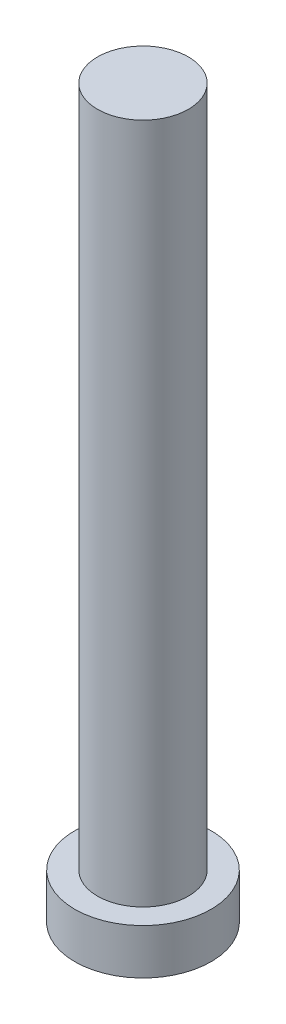
ISO-10303-21;
HEADER;
FILE_DESCRIPTION(('STEP AP214'),'2;1');
FILE_NAME('part.step','',(''),(''),'','','');
FILE_SCHEMA(('AUTOMOTIVE_DESIGN { 1 0 10303 214 1 1 1 1 }'));
ENDSEC;
DATA;
#1=APPLICATION_CONTEXT('core data for automotive mechanical design processes');
#2=APPLICATION_PROTOCOL_DEFINITION('international standard','automotive_design',2000,#1);
#3=PRODUCT_CONTEXT('',#1,'mechanical');
#4=PRODUCT('Part','Part','',(#3));
#5=PRODUCT_RELATED_PRODUCT_CATEGORY('part','',(#4));
#6=PRODUCT_DEFINITION_FORMATION('','',#4);
#7=PRODUCT_DEFINITION_CONTEXT('part definition',#1,'design');
#8=PRODUCT_DEFINITION('design','',#6,#7);
#9=PRODUCT_DEFINITION_SHAPE('','',#8);
#10=(LENGTH_UNIT() NAMED_UNIT(*) SI_UNIT(.MILLI.,.METRE.));
#11=(NAMED_UNIT(*) PLANE_ANGLE_UNIT() SI_UNIT($,.RADIAN.));
#12=(NAMED_UNIT(*) SI_UNIT($,.STERADIAN.) SOLID_ANGLE_UNIT());
#13=UNCERTAINTY_MEASURE_WITH_UNIT(LENGTH_MEASURE(1.E-05),#10,'distance_accuracy_value','');
#14=(GEOMETRIC_REPRESENTATION_CONTEXT(3) GLOBAL_UNCERTAINTY_ASSIGNED_CONTEXT((#13)) GLOBAL_UNIT_ASSIGNED_CONTEXT((#10,
#11,#12)) REPRESENTATION_CONTEXT('',''));
#15=CARTESIAN_POINT('',(0.,0.,0.));
#16=DIRECTION('',(0.,0.,1.));
#17=DIRECTION('',(1.,0.,0.));
#18=AXIS2_PLACEMENT_3D('',#15,#16,#17);
#19=CARTESIAN_POINT('',(0.,10.,0.));
#20=DIRECTION('',(0.,-1.,0.));
#21=DIRECTION('',(0.,0.,-1.));
#22=AXIS2_PLACEMENT_3D('',#19,#20,#21);
#23=CYLINDRICAL_SURFACE('',#22,15.);
#24=CARTESIAN_POINT('',(0.,10.,0.));
#25=DIRECTION('',(0.,1.,0.));
#26=DIRECTION('',(0.,0.,1.));
#27=AXIS2_PLACEMENT_3D('',#24,#25,#26);
#28=CIRCLE('',#27,15.);
#29=CARTESIAN_POINT('',(0.,10.,15.));
#30=VERTEX_POINT('',#29);
#31=EDGE_CURVE('E41',#30,#30,#28,.T.);
#32=ORIENTED_EDGE('',*,*,#31,.F.);
#33=EDGE_LOOP('',(#32));
#34=FACE_BOUND('',#33,.T.);
#35=CARTESIAN_POINT('',(0.,0.,0.));
#36=DIRECTION('',(0.,1.,0.));
#37=DIRECTION('',(0.,0.,1.));
#38=AXIS2_PLACEMENT_3D('',#35,#36,#37);
#39=CIRCLE('',#38,15.);
#40=CARTESIAN_POINT('',(0.,0.,15.));
#41=VERTEX_POINT('',#40);
#42=EDGE_CURVE('E37',#41,#41,#39,.T.);
#43=ORIENTED_EDGE('',*,*,#42,.T.);
#44=EDGE_LOOP('',(#43));
#45=FACE_BOUND('',#44,.T.);
#46=ADVANCED_FACE('F34',(#34,#45),#23,.T.);
#47=CARTESIAN_POINT('',(0.,10.,0.));
#48=DIRECTION('',(0.,1.,0.));
#49=DIRECTION('',(0.,0.,1.));
#50=AXIS2_PLACEMENT_3D('',#47,#48,#49);
#51=PLANE('',#50);
#52=CARTESIAN_POINT('',(0.,10.,0.));
#53=DIRECTION('',(0.,1.,0.));
#54=DIRECTION('',(0.,0.,1.));
#55=AXIS2_PLACEMENT_3D('',#52,#53,#54);
#56=CIRCLE('',#55,10.);
#57=CARTESIAN_POINT('',(0.,10.,10.));
#58=VERTEX_POINT('',#57);
#59=EDGE_CURVE('E10',#58,#58,#56,.T.);
#60=ORIENTED_EDGE('',*,*,#59,.F.);
#61=EDGE_LOOP('',(#60));
#62=FACE_BOUND('',#61,.T.);
#63=ORIENTED_EDGE('',*,*,#31,.T.);
#64=EDGE_LOOP('',(#63));
#65=FACE_BOUND('',#64,.T.);
#66=ADVANCED_FACE('F58',(#62,#65),#51,.T.);
#67=CARTESIAN_POINT('',(0.,0.,0.));
#68=DIRECTION('',(0.,1.,0.));
#69=DIRECTION('',(0.,0.,1.));
#70=AXIS2_PLACEMENT_3D('',#67,#68,#69);
#71=PLANE('',#70);
#72=ORIENTED_EDGE('',*,*,#42,.F.);
#73=EDGE_LOOP('',(#72));
#74=FACE_BOUND('',#73,.T.);
#75=ADVANCED_FACE('F55',(#74),#71,.F.);
#76=CARTESIAN_POINT('',(0.,160.,0.));
#77=DIRECTION('',(0.,-1.,0.));
#78=DIRECTION('',(0.,0.,-1.));
#79=AXIS2_PLACEMENT_3D('',#76,#77,#78);
#80=CYLINDRICAL_SURFACE('',#79,10.);
#81=CARTESIAN_POINT('',(0.,160.,0.));
#82=DIRECTION('',(0.,1.,0.));
#83=DIRECTION('',(0.,0.,1.));
#84=AXIS2_PLACEMENT_3D('',#81,#82,#83);
#85=CIRCLE('',#84,10.);
#86=CARTESIAN_POINT('',(0.,160.,10.));
#87=VERTEX_POINT('',#86);
#88=EDGE_CURVE('E47',#87,#87,#85,.T.);
#89=ORIENTED_EDGE('',*,*,#88,.F.);
#90=EDGE_LOOP('',(#89));
#91=FACE_BOUND('',#90,.T.);
#92=ORIENTED_EDGE('',*,*,#59,.T.);
#93=EDGE_LOOP('',(#92));
#94=FACE_BOUND('',#93,.T.);
#95=ADVANCED_FACE('F57',(#91,#94),#80,.T.);
#96=CARTESIAN_POINT('',(0.,160.,0.));
#97=DIRECTION('',(0.,1.,0.));
#98=DIRECTION('',(0.,0.,1.));
#99=AXIS2_PLACEMENT_3D('',#96,#97,#98);
#100=PLANE('',#99);
#101=ORIENTED_EDGE('',*,*,#88,.T.);
#102=EDGE_LOOP('',(#101));
#103=FACE_BOUND('',#102,.T.);
#104=ADVANCED_FACE('F63',(#103),#100,.T.);
#105=CLOSED_SHELL('',(#46,#66,#75,#95,#104));
#106=MANIFOLD_SOLID_BREP('B2',#105);
#107=ADVANCED_BREP_SHAPE_REPRESENTATION('',(#18,#106),#14);
#108=SHAPE_DEFINITION_REPRESENTATION(#9,#107);
ENDSEC;
END-ISO-10303-21;
